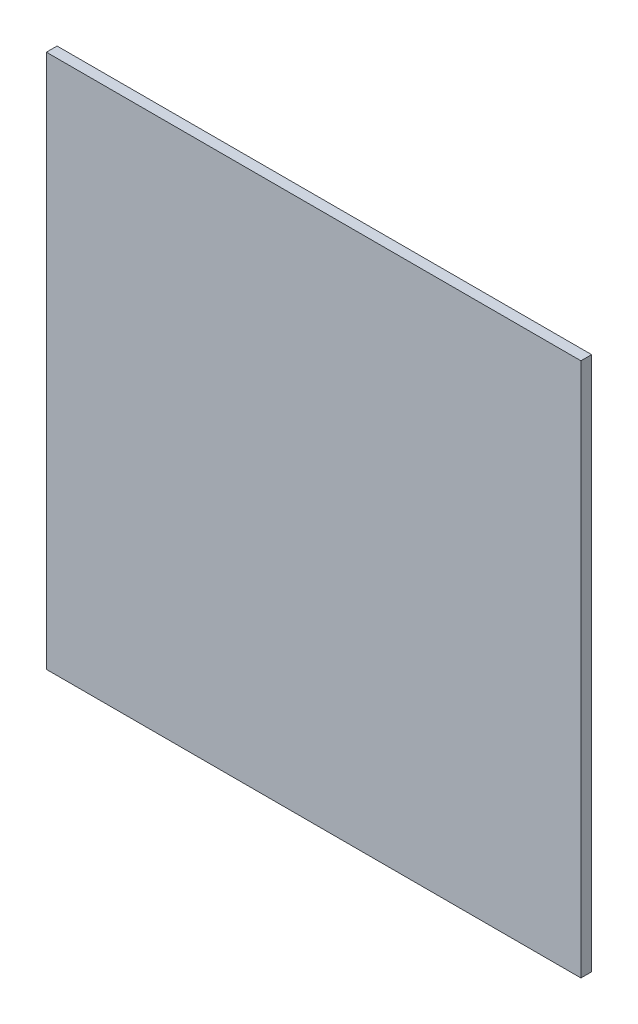
ISO-10303-21;
HEADER;
FILE_DESCRIPTION(('STEP AP214'),'2;1');
FILE_NAME('part.step','',(''),(''),'','','');
FILE_SCHEMA(('AUTOMOTIVE_DESIGN { 1 0 10303 214 1 1 1 1 }'));
ENDSEC;
DATA;
#1=APPLICATION_CONTEXT('core data for automotive mechanical design processes');
#2=APPLICATION_PROTOCOL_DEFINITION('international standard','automotive_design',2000,#1);
#3=PRODUCT_CONTEXT('',#1,'mechanical');
#4=PRODUCT('Part','Part','',(#3));
#5=PRODUCT_RELATED_PRODUCT_CATEGORY('part','',(#4));
#6=PRODUCT_DEFINITION_FORMATION('','',#4);
#7=PRODUCT_DEFINITION_CONTEXT('part definition',#1,'design');
#8=PRODUCT_DEFINITION('design','',#6,#7);
#9=PRODUCT_DEFINITION_SHAPE('','',#8);
#10=(LENGTH_UNIT() NAMED_UNIT(*) SI_UNIT(.MILLI.,.METRE.));
#11=(NAMED_UNIT(*) PLANE_ANGLE_UNIT() SI_UNIT($,.RADIAN.));
#12=(NAMED_UNIT(*) SI_UNIT($,.STERADIAN.) SOLID_ANGLE_UNIT());
#13=UNCERTAINTY_MEASURE_WITH_UNIT(LENGTH_MEASURE(1.E-05),#10,'distance_accuracy_value','');
#14=(GEOMETRIC_REPRESENTATION_CONTEXT(3) GLOBAL_UNCERTAINTY_ASSIGNED_CONTEXT((#13)) GLOBAL_UNIT_ASSIGNED_CONTEXT((#10,
#11,#12)) REPRESENTATION_CONTEXT('',''));
#15=CARTESIAN_POINT('',(0.,0.,0.));
#16=DIRECTION('',(0.,0.,1.));
#17=DIRECTION('',(1.,0.,0.));
#18=AXIS2_PLACEMENT_3D('',#15,#16,#17);
#19=CARTESIAN_POINT('',(125.,125.,5.));
#20=DIRECTION('',(-1.,0.,0.));
#21=DIRECTION('',(0.,-1.,0.));
#22=AXIS2_PLACEMENT_3D('',#19,#20,#21);
#23=PLANE('',#22);
#24=DIRECTION('',(0.,1.,0.));
#25=VECTOR('',#24,1.);
#26=CARTESIAN_POINT('',(125.,125.,0.));
#27=LINE('',#26,#25);
#28=CARTESIAN_POINT('',(125.,-125.,0.));
#29=VERTEX_POINT('',#28);
#30=CARTESIAN_POINT('',(125.,125.,0.));
#31=VERTEX_POINT('',#30);
#32=EDGE_CURVE('E111',#29,#31,#27,.T.);
#33=ORIENTED_EDGE('',*,*,#32,.T.);
#34=DIRECTION('',(0.,0.,-1.));
#35=VECTOR('',#34,1.);
#36=CARTESIAN_POINT('',(125.,125.,5.));
#37=LINE('',#36,#35);
#38=CARTESIAN_POINT('',(125.,125.,5.));
#39=VERTEX_POINT('',#38);
#40=EDGE_CURVE('E11',#39,#31,#37,.T.);
#41=ORIENTED_EDGE('',*,*,#40,.F.);
#42=DIRECTION('',(0.,1.,0.));
#43=VECTOR('',#42,1.);
#44=CARTESIAN_POINT('',(125.,125.,5.));
#45=LINE('',#44,#43);
#46=CARTESIAN_POINT('',(125.,-125.,5.));
#47=VERTEX_POINT('',#46);
#48=EDGE_CURVE('E95',#47,#39,#45,.T.);
#49=ORIENTED_EDGE('',*,*,#48,.F.);
#50=DIRECTION('',(0.,0.,-1.));
#51=VECTOR('',#50,1.);
#52=CARTESIAN_POINT('',(125.,-125.,5.));
#53=LINE('',#52,#51);
#54=EDGE_CURVE('E107',#47,#29,#53,.T.);
#55=ORIENTED_EDGE('',*,*,#54,.T.);
#56=EDGE_LOOP('',(#33,#41,#49,#55));
#57=FACE_BOUND('',#56,.T.);
#58=ADVANCED_FACE('F43',(#57),#23,.F.);
#59=CARTESIAN_POINT('',(-125.,125.,5.));
#60=DIRECTION('',(0.,-1.,0.));
#61=DIRECTION('',(0.,0.,-1.));
#62=AXIS2_PLACEMENT_3D('',#59,#60,#61);
#63=PLANE('',#62);
#64=DIRECTION('',(-1.,0.,0.));
#65=VECTOR('',#64,1.);
#66=CARTESIAN_POINT('',(-125.,125.,0.));
#67=LINE('',#66,#65);
#68=CARTESIAN_POINT('',(-125.,125.,0.));
#69=VERTEX_POINT('',#68);
#70=EDGE_CURVE('E100',#31,#69,#67,.T.);
#71=ORIENTED_EDGE('',*,*,#70,.T.);
#72=DIRECTION('',(0.,0.,-1.));
#73=VECTOR('',#72,1.);
#74=CARTESIAN_POINT('',(-125.,125.,5.));
#75=LINE('',#74,#73);
#76=CARTESIAN_POINT('',(-125.,125.,5.));
#77=VERTEX_POINT('',#76);
#78=EDGE_CURVE('E52',#77,#69,#75,.T.);
#79=ORIENTED_EDGE('',*,*,#78,.F.);
#80=DIRECTION('',(-1.,0.,0.));
#81=VECTOR('',#80,1.);
#82=CARTESIAN_POINT('',(-125.,125.,5.));
#83=LINE('',#82,#81);
#84=EDGE_CURVE('E90',#39,#77,#83,.T.);
#85=ORIENTED_EDGE('',*,*,#84,.F.);
#86=ORIENTED_EDGE('',*,*,#40,.T.);
#87=EDGE_LOOP('',(#71,#79,#85,#86));
#88=FACE_BOUND('',#87,.T.);
#89=ADVANCED_FACE('F99',(#88),#63,.F.);
#90=CARTESIAN_POINT('',(-125.,125.,5.));
#91=DIRECTION('',(1.,0.,0.));
#92=DIRECTION('',(0.,1.,0.));
#93=AXIS2_PLACEMENT_3D('',#90,#91,#92);
#94=PLANE('',#93);
#95=DIRECTION('',(0.,-1.,0.));
#96=VECTOR('',#95,1.);
#97=CARTESIAN_POINT('',(-125.,125.,0.));
#98=LINE('',#97,#96);
#99=CARTESIAN_POINT('',(-125.,-125.,0.));
#100=VERTEX_POINT('',#99);
#101=EDGE_CURVE('E77',#69,#100,#98,.T.);
#102=ORIENTED_EDGE('',*,*,#101,.T.);
#103=DIRECTION('',(0.,0.,-1.));
#104=VECTOR('',#103,1.);
#105=CARTESIAN_POINT('',(-125.,-125.,5.));
#106=LINE('',#105,#104);
#107=CARTESIAN_POINT('',(-125.,-125.,5.));
#108=VERTEX_POINT('',#107);
#109=EDGE_CURVE('E102',#108,#100,#106,.T.);
#110=ORIENTED_EDGE('',*,*,#109,.F.);
#111=DIRECTION('',(0.,-1.,0.));
#112=VECTOR('',#111,1.);
#113=CARTESIAN_POINT('',(-125.,125.,5.));
#114=LINE('',#113,#112);
#115=EDGE_CURVE('E93',#77,#108,#114,.T.);
#116=ORIENTED_EDGE('',*,*,#115,.F.);
#117=ORIENTED_EDGE('',*,*,#78,.T.);
#118=EDGE_LOOP('',(#102,#110,#116,#117));
#119=FACE_BOUND('',#118,.T.);
#120=ADVANCED_FACE('F103',(#119),#94,.F.);
#121=CARTESIAN_POINT('',(-125.,-125.,5.));
#122=DIRECTION('',(0.,1.,0.));
#123=DIRECTION('',(0.,0.,1.));
#124=AXIS2_PLACEMENT_3D('',#121,#122,#123);
#125=PLANE('',#124);
#126=DIRECTION('',(1.,0.,0.));
#127=VECTOR('',#126,1.);
#128=CARTESIAN_POINT('',(-125.,-125.,0.));
#129=LINE('',#128,#127);
#130=EDGE_CURVE('E83',#100,#29,#129,.T.);
#131=ORIENTED_EDGE('',*,*,#130,.T.);
#132=ORIENTED_EDGE('',*,*,#54,.F.);
#133=DIRECTION('',(1.,0.,0.));
#134=VECTOR('',#133,1.);
#135=CARTESIAN_POINT('',(-125.,-125.,5.));
#136=LINE('',#135,#134);
#137=EDGE_CURVE('E60',#108,#47,#136,.T.);
#138=ORIENTED_EDGE('',*,*,#137,.F.);
#139=ORIENTED_EDGE('',*,*,#109,.T.);
#140=EDGE_LOOP('',(#131,#132,#138,#139));
#141=FACE_BOUND('',#140,.T.);
#142=ADVANCED_FACE('F124',(#141),#125,.F.);
#143=CARTESIAN_POINT('',(0.,0.,5.));
#144=DIRECTION('',(0.,0.,1.));
#145=DIRECTION('',(1.,0.,0.));
#146=AXIS2_PLACEMENT_3D('',#143,#144,#145);
#147=PLANE('',#146);
#148=ORIENTED_EDGE('',*,*,#48,.T.);
#149=ORIENTED_EDGE('',*,*,#84,.T.);
#150=ORIENTED_EDGE('',*,*,#115,.T.);
#151=ORIENTED_EDGE('',*,*,#137,.T.);
#152=EDGE_LOOP('',(#148,#149,#150,#151));
#153=FACE_BOUND('',#152,.T.);
#154=ADVANCED_FACE('F91',(#153),#147,.T.);
#155=CARTESIAN_POINT('',(0.,0.,0.));
#156=DIRECTION('',(0.,0.,1.));
#157=DIRECTION('',(1.,0.,0.));
#158=AXIS2_PLACEMENT_3D('',#155,#156,#157);
#159=PLANE('',#158);
#160=ORIENTED_EDGE('',*,*,#32,.F.);
#161=ORIENTED_EDGE('',*,*,#130,.F.);
#162=ORIENTED_EDGE('',*,*,#101,.F.);
#163=ORIENTED_EDGE('',*,*,#70,.F.);
#164=EDGE_LOOP('',(#160,#161,#162,#163));
#165=FACE_BOUND('',#164,.T.);
#166=ADVANCED_FACE('F127',(#165),#159,.F.);
#167=CLOSED_SHELL('',(#58,#89,#120,#142,#154,#166));
#168=MANIFOLD_SOLID_BREP('B2',#167);
#169=ADVANCED_BREP_SHAPE_REPRESENTATION('',(#18,#168),#14);
#170=SHAPE_DEFINITION_REPRESENTATION(#9,#169);
ENDSEC;
END-ISO-10303-21;
